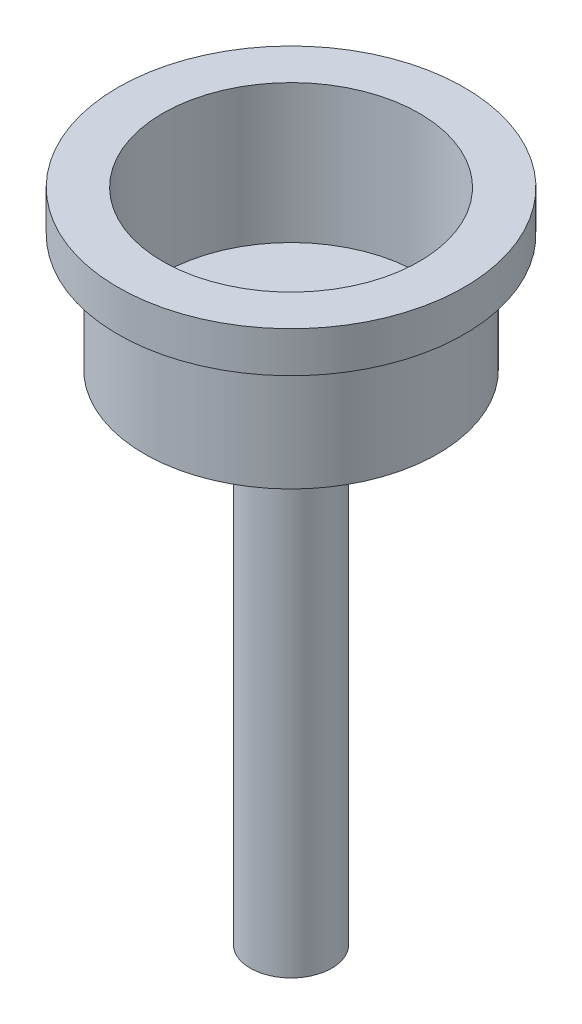
ISO-10303-21;
HEADER;
FILE_DESCRIPTION(('STEP AP214'),'2;1');
FILE_NAME('part.step','',(''),(''),'','','');
FILE_SCHEMA(('AUTOMOTIVE_DESIGN { 1 0 10303 214 1 1 1 1 }'));
ENDSEC;
DATA;
#1=APPLICATION_CONTEXT('core data for automotive mechanical design processes');
#2=APPLICATION_PROTOCOL_DEFINITION('international standard','automotive_design',2000,#1);
#3=PRODUCT_CONTEXT('',#1,'mechanical');
#4=PRODUCT('Part','Part','',(#3));
#5=PRODUCT_RELATED_PRODUCT_CATEGORY('part','',(#4));
#6=PRODUCT_DEFINITION_FORMATION('','',#4);
#7=PRODUCT_DEFINITION_CONTEXT('part definition',#1,'design');
#8=PRODUCT_DEFINITION('design','',#6,#7);
#9=PRODUCT_DEFINITION_SHAPE('','',#8);
#10=(LENGTH_UNIT() NAMED_UNIT(*) SI_UNIT(.MILLI.,.METRE.));
#11=(NAMED_UNIT(*) PLANE_ANGLE_UNIT() SI_UNIT($,.RADIAN.));
#12=(NAMED_UNIT(*) SI_UNIT($,.STERADIAN.) SOLID_ANGLE_UNIT());
#13=UNCERTAINTY_MEASURE_WITH_UNIT(LENGTH_MEASURE(1.E-05),#10,'distance_accuracy_value','');
#14=(GEOMETRIC_REPRESENTATION_CONTEXT(3) GLOBAL_UNCERTAINTY_ASSIGNED_CONTEXT((#13)) GLOBAL_UNIT_ASSIGNED_CONTEXT((#10,
#11,#12)) REPRESENTATION_CONTEXT('',''));
#15=CARTESIAN_POINT('',(0.,0.,0.));
#16=DIRECTION('',(0.,0.,1.));
#17=DIRECTION('',(1.,0.,0.));
#18=AXIS2_PLACEMENT_3D('',#15,#16,#17);
#19=CARTESIAN_POINT('',(0.,4.83,0.));
#20=DIRECTION('',(0.,1.,0.));
#21=DIRECTION('',(-1.,0.,0.));
#22=AXIS2_PLACEMENT_3D('',#19,#20,#21);
#23=CYLINDRICAL_SURFACE('',#22,0.26);
#24=CARTESIAN_POINT('',(0.,0.,0.));
#25=DIRECTION('',(0.,1.,0.));
#26=DIRECTION('',(-1.,0.,0.));
#27=AXIS2_PLACEMENT_3D('',#24,#25,#26);
#28=CIRCLE('',#27,0.26);
#29=CARTESIAN_POINT('',(-0.26,0.,0.));
#30=VERTEX_POINT('',#29);
#31=EDGE_CURVE('E10',#30,#30,#28,.T.);
#32=ORIENTED_EDGE('',*,*,#31,.F.);
#33=EDGE_LOOP('',(#32));
#34=FACE_BOUND('',#33,.T.);
#35=CARTESIAN_POINT('',(0.,3.81,0.));
#36=DIRECTION('',(0.,1.,0.));
#37=DIRECTION('',(-1.,0.,0.));
#38=AXIS2_PLACEMENT_3D('',#35,#36,#37);
#39=CIRCLE('',#38,0.26);
#40=CARTESIAN_POINT('',(-0.26,3.81,0.));
#41=VERTEX_POINT('',#40);
#42=EDGE_CURVE('E80',#41,#41,#39,.T.);
#43=ORIENTED_EDGE('',*,*,#42,.T.);
#44=EDGE_LOOP('',(#43));
#45=FACE_BOUND('',#44,.T.);
#46=ADVANCED_FACE('F37',(#34,#45),#23,.F.);
#47=CARTESIAN_POINT('',(0.26,0.,0.));
#48=DIRECTION('',(0.,1.,0.));
#49=DIRECTION('',(-1.,0.,0.));
#50=AXIS2_PLACEMENT_3D('',#47,#48,#49);
#51=PLANE('',#50);
#52=CARTESIAN_POINT('',(0.,0.,0.));
#53=DIRECTION('',(0.,1.,0.));
#54=DIRECTION('',(-1.,0.,0.));
#55=AXIS2_PLACEMENT_3D('',#52,#53,#54);
#56=CIRCLE('',#55,0.3);
#57=CARTESIAN_POINT('',(-0.3,0.,0.));
#58=VERTEX_POINT('',#57);
#59=EDGE_CURVE('E44',#58,#58,#56,.T.);
#60=ORIENTED_EDGE('',*,*,#59,.F.);
#61=EDGE_LOOP('',(#60));
#62=FACE_BOUND('',#61,.T.);
#63=ORIENTED_EDGE('',*,*,#31,.T.);
#64=EDGE_LOOP('',(#63));
#65=FACE_BOUND('',#64,.T.);
#66=ADVANCED_FACE('F130',(#62,#65),#51,.F.);
#67=CARTESIAN_POINT('',(0.,4.83,0.));
#68=DIRECTION('',(0.,1.,0.));
#69=DIRECTION('',(-1.,0.,0.));
#70=AXIS2_PLACEMENT_3D('',#67,#68,#69);
#71=CYLINDRICAL_SURFACE('',#70,0.3);
#72=CARTESIAN_POINT('',(0.,3.67,0.));
#73=DIRECTION('',(0.,1.,0.));
#74=DIRECTION('',(-1.,0.,0.));
#75=AXIS2_PLACEMENT_3D('',#72,#73,#74);
#76=CIRCLE('',#75,0.3);
#77=CARTESIAN_POINT('',(-0.3,3.67,0.));
#78=VERTEX_POINT('',#77);
#79=EDGE_CURVE('E49',#78,#78,#76,.T.);
#80=ORIENTED_EDGE('',*,*,#79,.F.);
#81=EDGE_LOOP('',(#80));
#82=FACE_BOUND('',#81,.T.);
#83=ORIENTED_EDGE('',*,*,#59,.T.);
#84=EDGE_LOOP('',(#83));
#85=FACE_BOUND('',#84,.T.);
#86=ADVANCED_FACE('F125',(#82,#85),#71,.T.);
#87=CARTESIAN_POINT('',(0.3,3.67,0.));
#88=DIRECTION('',(0.,1.,0.));
#89=DIRECTION('',(-1.,0.,0.));
#90=AXIS2_PLACEMENT_3D('',#87,#88,#89);
#91=PLANE('',#90);
#92=CARTESIAN_POINT('',(0.,3.67,0.));
#93=DIRECTION('',(0.,1.,0.));
#94=DIRECTION('',(-1.,0.,0.));
#95=AXIS2_PLACEMENT_3D('',#92,#93,#94);
#96=CIRCLE('',#95,1.08);
#97=CARTESIAN_POINT('',(-1.08,3.67,0.));
#98=VERTEX_POINT('',#97);
#99=EDGE_CURVE('E54',#98,#98,#96,.T.);
#100=ORIENTED_EDGE('',*,*,#99,.F.);
#101=EDGE_LOOP('',(#100));
#102=FACE_BOUND('',#101,.T.);
#103=ORIENTED_EDGE('',*,*,#79,.T.);
#104=EDGE_LOOP('',(#103));
#105=FACE_BOUND('',#104,.T.);
#106=ADVANCED_FACE('F119',(#102,#105),#91,.F.);
#107=CARTESIAN_POINT('',(0.,4.83,0.));
#108=DIRECTION('',(0.,1.,0.));
#109=DIRECTION('',(-1.,0.,0.));
#110=AXIS2_PLACEMENT_3D('',#107,#108,#109);
#111=CYLINDRICAL_SURFACE('',#110,1.08);
#112=CARTESIAN_POINT('',(0.,4.53,0.));
#113=DIRECTION('',(0.,1.,0.));
#114=DIRECTION('',(-1.,0.,0.));
#115=AXIS2_PLACEMENT_3D('',#112,#113,#114);
#116=CIRCLE('',#115,1.08);
#117=CARTESIAN_POINT('',(-1.08,4.53,0.));
#118=VERTEX_POINT('',#117);
#119=EDGE_CURVE('E60',#118,#118,#116,.T.);
#120=ORIENTED_EDGE('',*,*,#119,.F.);
#121=EDGE_LOOP('',(#120));
#122=FACE_BOUND('',#121,.T.);
#123=ORIENTED_EDGE('',*,*,#99,.T.);
#124=EDGE_LOOP('',(#123));
#125=FACE_BOUND('',#124,.T.);
#126=ADVANCED_FACE('F113',(#122,#125),#111,.T.);
#127=CARTESIAN_POINT('',(1.08,4.53,0.));
#128=DIRECTION('',(0.,1.,0.));
#129=DIRECTION('',(-1.,0.,0.));
#130=AXIS2_PLACEMENT_3D('',#127,#128,#129);
#131=PLANE('',#130);
#132=CARTESIAN_POINT('',(0.,4.53,0.));
#133=DIRECTION('',(0.,1.,0.));
#134=DIRECTION('',(-1.,0.,0.));
#135=AXIS2_PLACEMENT_3D('',#132,#133,#134);
#136=CIRCLE('',#135,1.275);
#137=CARTESIAN_POINT('',(-1.275,4.53,0.));
#138=VERTEX_POINT('',#137);
#139=EDGE_CURVE('E64',#138,#138,#136,.T.);
#140=ORIENTED_EDGE('',*,*,#139,.F.);
#141=EDGE_LOOP('',(#140));
#142=FACE_BOUND('',#141,.T.);
#143=ORIENTED_EDGE('',*,*,#119,.T.);
#144=EDGE_LOOP('',(#143));
#145=FACE_BOUND('',#144,.T.);
#146=ADVANCED_FACE('F107',(#142,#145),#131,.F.);
#147=CARTESIAN_POINT('',(0.,4.83,0.));
#148=DIRECTION('',(0.,1.,0.));
#149=DIRECTION('',(-1.,0.,0.));
#150=AXIS2_PLACEMENT_3D('',#147,#148,#149);
#151=CYLINDRICAL_SURFACE('',#150,1.275);
#152=CARTESIAN_POINT('',(0.,4.83,0.));
#153=DIRECTION('',(0.,1.,0.));
#154=DIRECTION('',(-1.,0.,0.));
#155=AXIS2_PLACEMENT_3D('',#152,#153,#154);
#156=CIRCLE('',#155,1.275);
#157=CARTESIAN_POINT('',(-1.275,4.83,0.));
#158=VERTEX_POINT('',#157);
#159=EDGE_CURVE('E68',#158,#158,#156,.T.);
#160=ORIENTED_EDGE('',*,*,#159,.F.);
#161=EDGE_LOOP('',(#160));
#162=FACE_BOUND('',#161,.T.);
#163=ORIENTED_EDGE('',*,*,#139,.T.);
#164=EDGE_LOOP('',(#163));
#165=FACE_BOUND('',#164,.T.);
#166=ADVANCED_FACE('F101',(#162,#165),#151,.T.);
#167=CARTESIAN_POINT('',(1.275,4.83,0.));
#168=DIRECTION('',(0.,-1.,0.));
#169=DIRECTION('',(1.,0.,0.));
#170=AXIS2_PLACEMENT_3D('',#167,#168,#169);
#171=PLANE('',#170);
#172=CARTESIAN_POINT('',(0.,4.83,0.));
#173=DIRECTION('',(0.,1.,0.));
#174=DIRECTION('',(-1.,0.,0.));
#175=AXIS2_PLACEMENT_3D('',#172,#173,#174);
#176=CIRCLE('',#175,0.945);
#177=CARTESIAN_POINT('',(-0.945000000000001,4.83,0.));
#178=VERTEX_POINT('',#177);
#179=EDGE_CURVE('E72',#178,#178,#176,.T.);
#180=ORIENTED_EDGE('',*,*,#179,.F.);
#181=EDGE_LOOP('',(#180));
#182=FACE_BOUND('',#181,.T.);
#183=ORIENTED_EDGE('',*,*,#159,.T.);
#184=EDGE_LOOP('',(#183));
#185=FACE_BOUND('',#184,.T.);
#186=ADVANCED_FACE('F95',(#182,#185),#171,.F.);
#187=CARTESIAN_POINT('',(0.,4.83,0.));
#188=DIRECTION('',(0.,1.,0.));
#189=DIRECTION('',(-1.,0.,0.));
#190=AXIS2_PLACEMENT_3D('',#187,#188,#189);
#191=CYLINDRICAL_SURFACE('',#190,0.945);
#192=CARTESIAN_POINT('',(0.,3.81,0.));
#193=DIRECTION('',(0.,1.,0.));
#194=DIRECTION('',(-1.,0.,0.));
#195=AXIS2_PLACEMENT_3D('',#192,#193,#194);
#196=CIRCLE('',#195,0.945);
#197=CARTESIAN_POINT('',(-0.945000000000001,3.81,0.));
#198=VERTEX_POINT('',#197);
#199=EDGE_CURVE('E76',#198,#198,#196,.T.);
#200=ORIENTED_EDGE('',*,*,#199,.F.);
#201=EDGE_LOOP('',(#200));
#202=FACE_BOUND('',#201,.T.);
#203=ORIENTED_EDGE('',*,*,#179,.T.);
#204=EDGE_LOOP('',(#203));
#205=FACE_BOUND('',#204,.T.);
#206=ADVANCED_FACE('F89',(#202,#205),#191,.F.);
#207=CARTESIAN_POINT('',(0.945,3.81,0.));
#208=DIRECTION('',(0.,-1.,0.));
#209=DIRECTION('',(1.,0.,0.));
#210=AXIS2_PLACEMENT_3D('',#207,#208,#209);
#211=PLANE('',#210);
#212=ORIENTED_EDGE('',*,*,#42,.F.);
#213=EDGE_LOOP('',(#212));
#214=FACE_BOUND('',#213,.T.);
#215=ORIENTED_EDGE('',*,*,#199,.T.);
#216=EDGE_LOOP('',(#215));
#217=FACE_BOUND('',#216,.T.);
#218=ADVANCED_FACE('F86',(#214,#217),#211,.F.);
#219=CLOSED_SHELL('',(#46,#66,#86,#106,#126,#146,#166,#186,#206,#218));
#220=MANIFOLD_SOLID_BREP('B2',#219);
#221=ADVANCED_BREP_SHAPE_REPRESENTATION('',(#18,#220),#14);
#222=SHAPE_DEFINITION_REPRESENTATION(#9,#221);
ENDSEC;
END-ISO-10303-21;
